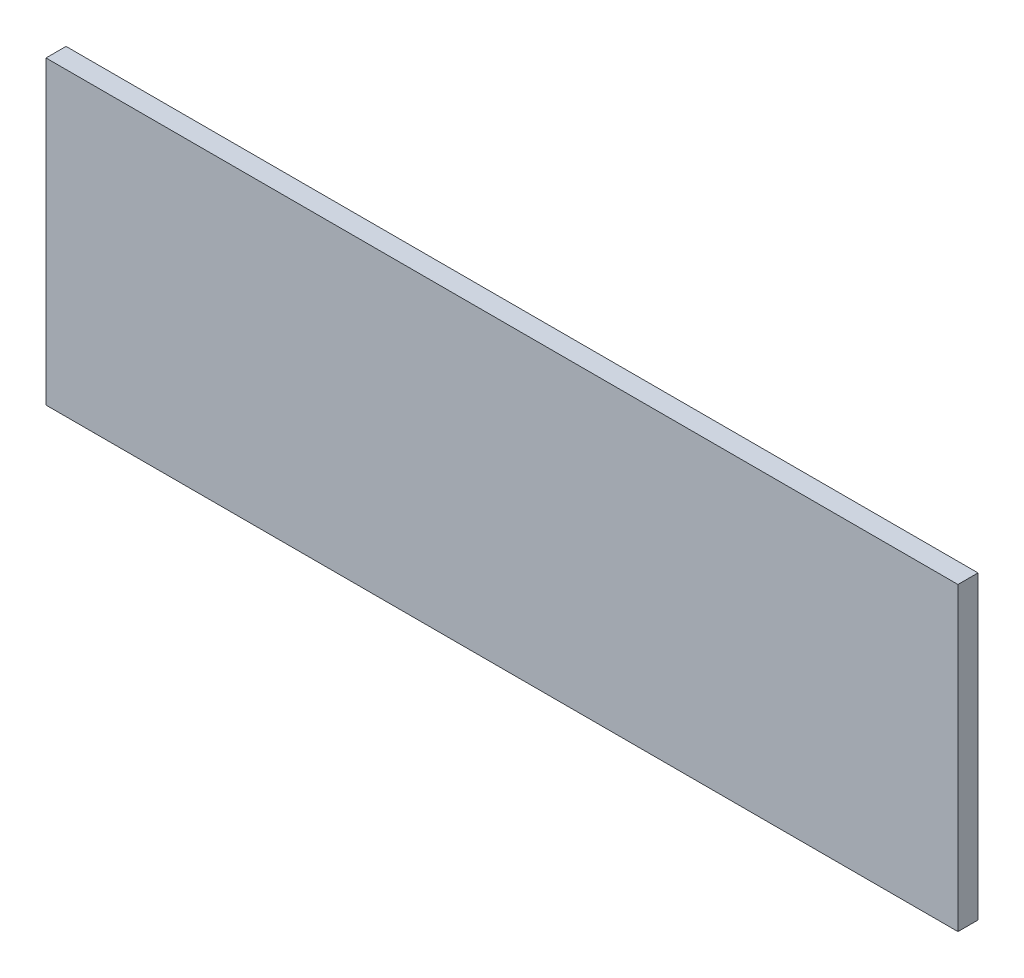
ISO-10303-21;
HEADER;
FILE_DESCRIPTION(('STEP AP214'),'2;1');
FILE_NAME('part.step','',(''),(''),'','','');
FILE_SCHEMA(('AUTOMOTIVE_DESIGN { 1 0 10303 214 1 1 1 1 }'));
ENDSEC;
DATA;
#1=APPLICATION_CONTEXT('core data for automotive mechanical design processes');
#2=APPLICATION_PROTOCOL_DEFINITION('international standard','automotive_design',2000,#1);
#3=PRODUCT_CONTEXT('',#1,'mechanical');
#4=PRODUCT('Part','Part','',(#3));
#5=PRODUCT_RELATED_PRODUCT_CATEGORY('part','',(#4));
#6=PRODUCT_DEFINITION_FORMATION('','',#4);
#7=PRODUCT_DEFINITION_CONTEXT('part definition',#1,'design');
#8=PRODUCT_DEFINITION('design','',#6,#7);
#9=PRODUCT_DEFINITION_SHAPE('','',#8);
#10=(LENGTH_UNIT() NAMED_UNIT(*) SI_UNIT(.MILLI.,.METRE.));
#11=(NAMED_UNIT(*) PLANE_ANGLE_UNIT() SI_UNIT($,.RADIAN.));
#12=(NAMED_UNIT(*) SI_UNIT($,.STERADIAN.) SOLID_ANGLE_UNIT());
#13=UNCERTAINTY_MEASURE_WITH_UNIT(LENGTH_MEASURE(1.E-05),#10,'distance_accuracy_value','');
#14=(GEOMETRIC_REPRESENTATION_CONTEXT(3) GLOBAL_UNCERTAINTY_ASSIGNED_CONTEXT((#13)) GLOBAL_UNIT_ASSIGNED_CONTEXT((#10,
#11,#12)) REPRESENTATION_CONTEXT('',''));
#15=CARTESIAN_POINT('',(0.,0.,0.));
#16=DIRECTION('',(0.,0.,1.));
#17=DIRECTION('',(1.,0.,0.));
#18=AXIS2_PLACEMENT_3D('',#15,#16,#17);
#19=CARTESIAN_POINT('',(0.,0.,2.));
#20=DIRECTION('',(1.,0.,0.));
#21=DIRECTION('',(0.,0.,-1.));
#22=AXIS2_PLACEMENT_3D('',#19,#20,#21);
#23=PLANE('',#22);
#24=DIRECTION('',(0.,-1.,0.));
#25=VECTOR('',#24,1.);
#26=CARTESIAN_POINT('',(0.,0.,-2.));
#27=LINE('',#26,#25);
#28=CARTESIAN_POINT('',(0.,60.,-2.));
#29=VERTEX_POINT('',#28);
#30=CARTESIAN_POINT('',(0.,0.,-2.));
#31=VERTEX_POINT('',#30);
#32=EDGE_CURVE('E113',#29,#31,#27,.T.);
#33=ORIENTED_EDGE('',*,*,#32,.T.);
#34=DIRECTION('',(0.,0.,-1.));
#35=VECTOR('',#34,1.);
#36=CARTESIAN_POINT('',(0.,0.,2.));
#37=LINE('',#36,#35);
#38=CARTESIAN_POINT('',(0.,0.,2.));
#39=VERTEX_POINT('',#38);
#40=EDGE_CURVE('E11',#39,#31,#37,.T.);
#41=ORIENTED_EDGE('',*,*,#40,.F.);
#42=DIRECTION('',(0.,-1.,0.));
#43=VECTOR('',#42,1.);
#44=CARTESIAN_POINT('',(0.,0.,2.));
#45=LINE('',#44,#43);
#46=CARTESIAN_POINT('',(0.,60.,2.));
#47=VERTEX_POINT('',#46);
#48=EDGE_CURVE('E97',#47,#39,#45,.T.);
#49=ORIENTED_EDGE('',*,*,#48,.F.);
#50=DIRECTION('',(0.,0.,-1.));
#51=VECTOR('',#50,1.);
#52=CARTESIAN_POINT('',(0.,60.,2.));
#53=LINE('',#52,#51);
#54=EDGE_CURVE('E109',#47,#29,#53,.T.);
#55=ORIENTED_EDGE('',*,*,#54,.T.);
#56=EDGE_LOOP('',(#33,#41,#49,#55));
#57=FACE_BOUND('',#56,.T.);
#58=ADVANCED_FACE('F45',(#57),#23,.F.);
#59=CARTESIAN_POINT('',(0.,0.,2.));
#60=DIRECTION('',(0.,1.,0.));
#61=DIRECTION('',(0.,0.,1.));
#62=AXIS2_PLACEMENT_3D('',#59,#60,#61);
#63=PLANE('',#62);
#64=DIRECTION('',(1.,0.,0.));
#65=VECTOR('',#64,1.);
#66=CARTESIAN_POINT('',(0.,0.,-2.));
#67=LINE('',#66,#65);
#68=CARTESIAN_POINT('',(182.,0.,-2.));
#69=VERTEX_POINT('',#68);
#70=EDGE_CURVE('E102',#31,#69,#67,.T.);
#71=ORIENTED_EDGE('',*,*,#70,.T.);
#72=DIRECTION('',(0.,0.,-1.));
#73=VECTOR('',#72,1.);
#74=CARTESIAN_POINT('',(182.,0.,2.));
#75=LINE('',#74,#73);
#76=CARTESIAN_POINT('',(182.,0.,2.));
#77=VERTEX_POINT('',#76);
#78=EDGE_CURVE('E54',#77,#69,#75,.T.);
#79=ORIENTED_EDGE('',*,*,#78,.F.);
#80=DIRECTION('',(1.,0.,0.));
#81=VECTOR('',#80,1.);
#82=CARTESIAN_POINT('',(0.,0.,2.));
#83=LINE('',#82,#81);
#84=EDGE_CURVE('E92',#39,#77,#83,.T.);
#85=ORIENTED_EDGE('',*,*,#84,.F.);
#86=ORIENTED_EDGE('',*,*,#40,.T.);
#87=EDGE_LOOP('',(#71,#79,#85,#86));
#88=FACE_BOUND('',#87,.T.);
#89=ADVANCED_FACE('F101',(#88),#63,.F.);
#90=CARTESIAN_POINT('',(182.,0.,2.));
#91=DIRECTION('',(-1.,0.,0.));
#92=DIRECTION('',(0.,0.,1.));
#93=AXIS2_PLACEMENT_3D('',#90,#91,#92);
#94=PLANE('',#93);
#95=DIRECTION('',(0.,1.,0.));
#96=VECTOR('',#95,1.);
#97=CARTESIAN_POINT('',(182.,0.,-2.));
#98=LINE('',#97,#96);
#99=CARTESIAN_POINT('',(182.,60.,-2.));
#100=VERTEX_POINT('',#99);
#101=EDGE_CURVE('E79',#69,#100,#98,.T.);
#102=ORIENTED_EDGE('',*,*,#101,.T.);
#103=DIRECTION('',(0.,0.,-1.));
#104=VECTOR('',#103,1.);
#105=CARTESIAN_POINT('',(182.,60.,2.));
#106=LINE('',#105,#104);
#107=CARTESIAN_POINT('',(182.,60.,2.));
#108=VERTEX_POINT('',#107);
#109=EDGE_CURVE('E104',#108,#100,#106,.T.);
#110=ORIENTED_EDGE('',*,*,#109,.F.);
#111=DIRECTION('',(0.,1.,0.));
#112=VECTOR('',#111,1.);
#113=CARTESIAN_POINT('',(182.,0.,2.));
#114=LINE('',#113,#112);
#115=EDGE_CURVE('E95',#77,#108,#114,.T.);
#116=ORIENTED_EDGE('',*,*,#115,.F.);
#117=ORIENTED_EDGE('',*,*,#78,.T.);
#118=EDGE_LOOP('',(#102,#110,#116,#117));
#119=FACE_BOUND('',#118,.T.);
#120=ADVANCED_FACE('F105',(#119),#94,.F.);
#121=CARTESIAN_POINT('',(0.,60.,2.));
#122=DIRECTION('',(0.,-1.,0.));
#123=DIRECTION('',(0.,0.,-1.));
#124=AXIS2_PLACEMENT_3D('',#121,#122,#123);
#125=PLANE('',#124);
#126=DIRECTION('',(-1.,0.,0.));
#127=VECTOR('',#126,1.);
#128=CARTESIAN_POINT('',(0.,60.,-2.));
#129=LINE('',#128,#127);
#130=EDGE_CURVE('E85',#100,#29,#129,.T.);
#131=ORIENTED_EDGE('',*,*,#130,.T.);
#132=ORIENTED_EDGE('',*,*,#54,.F.);
#133=DIRECTION('',(-1.,0.,0.));
#134=VECTOR('',#133,1.);
#135=CARTESIAN_POINT('',(0.,60.,2.));
#136=LINE('',#135,#134);
#137=EDGE_CURVE('E62',#108,#47,#136,.T.);
#138=ORIENTED_EDGE('',*,*,#137,.F.);
#139=ORIENTED_EDGE('',*,*,#109,.T.);
#140=EDGE_LOOP('',(#131,#132,#138,#139));
#141=FACE_BOUND('',#140,.T.);
#142=ADVANCED_FACE('F126',(#141),#125,.F.);
#143=CARTESIAN_POINT('',(0.,0.,2.));
#144=DIRECTION('',(0.,0.,-1.));
#145=DIRECTION('',(-1.,0.,0.));
#146=AXIS2_PLACEMENT_3D('',#143,#144,#145);
#147=PLANE('',#146);
#148=ORIENTED_EDGE('',*,*,#48,.T.);
#149=ORIENTED_EDGE('',*,*,#84,.T.);
#150=ORIENTED_EDGE('',*,*,#115,.T.);
#151=ORIENTED_EDGE('',*,*,#137,.T.);
#152=EDGE_LOOP('',(#148,#149,#150,#151));
#153=FACE_BOUND('',#152,.T.);
#154=ADVANCED_FACE('F93',(#153),#147,.F.);
#155=CARTESIAN_POINT('',(0.,0.,-2.));
#156=DIRECTION('',(0.,0.,-1.));
#157=DIRECTION('',(-1.,0.,0.));
#158=AXIS2_PLACEMENT_3D('',#155,#156,#157);
#159=PLANE('',#158);
#160=ORIENTED_EDGE('',*,*,#32,.F.);
#161=ORIENTED_EDGE('',*,*,#130,.F.);
#162=ORIENTED_EDGE('',*,*,#101,.F.);
#163=ORIENTED_EDGE('',*,*,#70,.F.);
#164=EDGE_LOOP('',(#160,#161,#162,#163));
#165=FACE_BOUND('',#164,.T.);
#166=ADVANCED_FACE('F129',(#165),#159,.T.);
#167=CLOSED_SHELL('',(#58,#89,#120,#142,#154,#166));
#168=MANIFOLD_SOLID_BREP('B2',#167);
#169=ADVANCED_BREP_SHAPE_REPRESENTATION('',(#18,#168),#14);
#170=SHAPE_DEFINITION_REPRESENTATION(#9,#169);
ENDSEC;
END-ISO-10303-21;
